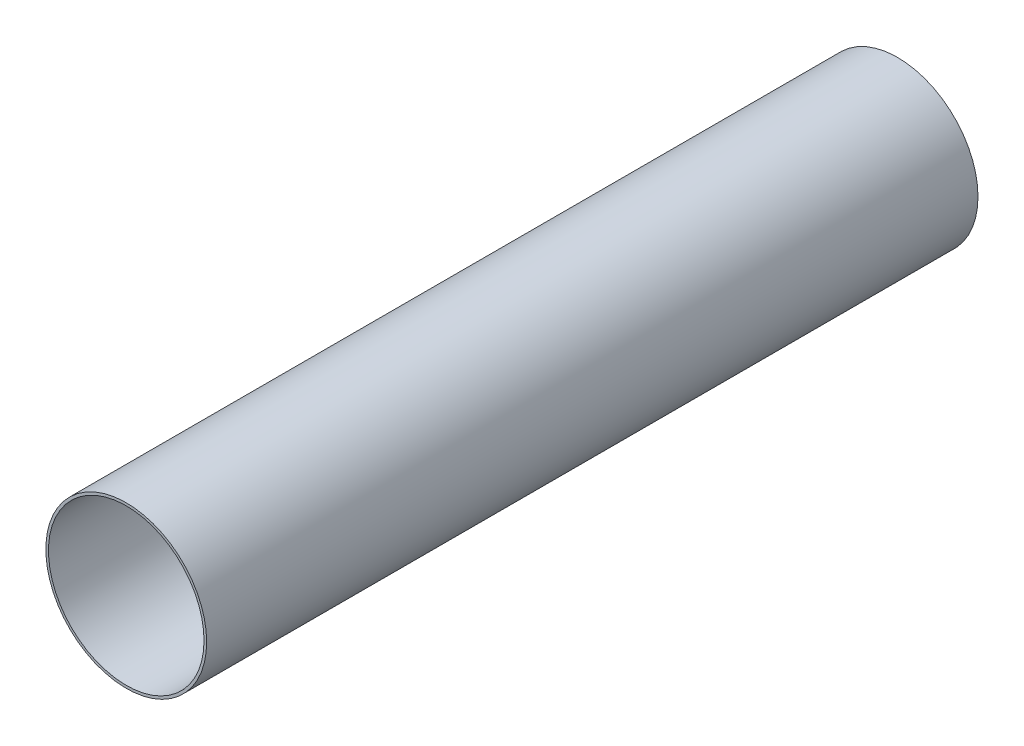
ISO-10303-21;
HEADER;
FILE_DESCRIPTION(('STEP AP214'),'2;1');
FILE_NAME('part.step','',(''),(''),'','','');
FILE_SCHEMA(('AUTOMOTIVE_DESIGN { 1 0 10303 214 1 1 1 1 }'));
ENDSEC;
DATA;
#1=APPLICATION_CONTEXT('core data for automotive mechanical design processes');
#2=APPLICATION_PROTOCOL_DEFINITION('international standard','automotive_design',2000,#1);
#3=PRODUCT_CONTEXT('',#1,'mechanical');
#4=PRODUCT('Part','Part','',(#3));
#5=PRODUCT_RELATED_PRODUCT_CATEGORY('part','',(#4));
#6=PRODUCT_DEFINITION_FORMATION('','',#4);
#7=PRODUCT_DEFINITION_CONTEXT('part definition',#1,'design');
#8=PRODUCT_DEFINITION('design','',#6,#7);
#9=PRODUCT_DEFINITION_SHAPE('','',#8);
#10=(LENGTH_UNIT() NAMED_UNIT(*) SI_UNIT(.MILLI.,.METRE.));
#11=(NAMED_UNIT(*) PLANE_ANGLE_UNIT() SI_UNIT($,.RADIAN.));
#12=(NAMED_UNIT(*) SI_UNIT($,.STERADIAN.) SOLID_ANGLE_UNIT());
#13=UNCERTAINTY_MEASURE_WITH_UNIT(LENGTH_MEASURE(1.E-05),#10,'distance_accuracy_value','');
#14=(GEOMETRIC_REPRESENTATION_CONTEXT(3) GLOBAL_UNCERTAINTY_ASSIGNED_CONTEXT((#13)) GLOBAL_UNIT_ASSIGNED_CONTEXT((#10,
#11,#12)) REPRESENTATION_CONTEXT('',''));
#15=CARTESIAN_POINT('',(0.,0.,0.));
#16=DIRECTION('',(0.,0.,1.));
#17=DIRECTION('',(1.,0.,0.));
#18=AXIS2_PLACEMENT_3D('',#15,#16,#17);
#19=CARTESIAN_POINT('',(0.,0.,295.));
#20=DIRECTION('',(0.,0.,1.));
#21=DIRECTION('',(1.,0.,0.));
#22=AXIS2_PLACEMENT_3D('',#19,#20,#21);
#23=PLANE('',#22);
#24=CARTESIAN_POINT('',(0.,0.,295.));
#25=DIRECTION('',(0.,0.,1.));
#26=DIRECTION('',(1.,0.,0.));
#27=AXIS2_PLACEMENT_3D('',#24,#25,#26);
#28=CIRCLE('',#27,61.5);
#29=CARTESIAN_POINT('',(61.5,0.,295.));
#30=VERTEX_POINT('',#29);
#31=EDGE_CURVE('E10',#30,#30,#28,.T.);
#32=ORIENTED_EDGE('',*,*,#31,.T.);
#33=EDGE_LOOP('',(#32));
#34=FACE_BOUND('',#33,.T.);
#35=CARTESIAN_POINT('',(0.,0.,295.));
#36=DIRECTION('',(0.,0.,1.));
#37=DIRECTION('',(1.,0.,0.));
#38=AXIS2_PLACEMENT_3D('',#35,#36,#37);
#39=CIRCLE('',#38,59.5);
#40=CARTESIAN_POINT('',(59.5,0.,295.));
#41=VERTEX_POINT('',#40);
#42=EDGE_CURVE('E54',#41,#41,#39,.T.);
#43=ORIENTED_EDGE('',*,*,#42,.F.);
#44=EDGE_LOOP('',(#43));
#45=FACE_BOUND('',#44,.T.);
#46=ADVANCED_FACE('F43',(#34,#45),#23,.T.);
#47=CARTESIAN_POINT('',(0.,0.,-295.));
#48=DIRECTION('',(0.,0.,1.));
#49=DIRECTION('',(1.,0.,0.));
#50=AXIS2_PLACEMENT_3D('',#47,#48,#49);
#51=PLANE('',#50);
#52=CARTESIAN_POINT('',(0.,0.,-295.));
#53=DIRECTION('',(0.,0.,1.));
#54=DIRECTION('',(1.,0.,0.));
#55=AXIS2_PLACEMENT_3D('',#52,#53,#54);
#56=CIRCLE('',#55,61.5);
#57=CARTESIAN_POINT('',(61.5,0.,-295.));
#58=VERTEX_POINT('',#57);
#59=EDGE_CURVE('E47',#58,#58,#56,.T.);
#60=ORIENTED_EDGE('',*,*,#59,.F.);
#61=EDGE_LOOP('',(#60));
#62=FACE_BOUND('',#61,.T.);
#63=CARTESIAN_POINT('',(0.,0.,-295.));
#64=DIRECTION('',(0.,0.,1.));
#65=DIRECTION('',(1.,0.,0.));
#66=AXIS2_PLACEMENT_3D('',#63,#64,#65);
#67=CIRCLE('',#66,59.5);
#68=CARTESIAN_POINT('',(59.5,0.,-295.));
#69=VERTEX_POINT('',#68);
#70=EDGE_CURVE('E56',#69,#69,#67,.T.);
#71=ORIENTED_EDGE('',*,*,#70,.T.);
#72=EDGE_LOOP('',(#71));
#73=FACE_BOUND('',#72,.T.);
#74=ADVANCED_FACE('F66',(#62,#73),#51,.F.);
#75=CARTESIAN_POINT('',(0.,0.,295.));
#76=DIRECTION('',(0.,0.,-1.));
#77=DIRECTION('',(-1.,0.,0.));
#78=AXIS2_PLACEMENT_3D('',#75,#76,#77);
#79=CYLINDRICAL_SURFACE('',#78,61.5);
#80=ORIENTED_EDGE('',*,*,#31,.F.);
#81=EDGE_LOOP('',(#80));
#82=FACE_BOUND('',#81,.T.);
#83=ORIENTED_EDGE('',*,*,#59,.T.);
#84=EDGE_LOOP('',(#83));
#85=FACE_BOUND('',#84,.T.);
#86=ADVANCED_FACE('F45',(#82,#85),#79,.T.);
#87=CARTESIAN_POINT('',(0.,0.,295.));
#88=DIRECTION('',(0.,0.,-1.));
#89=DIRECTION('',(-1.,0.,0.));
#90=AXIS2_PLACEMENT_3D('',#87,#88,#89);
#91=CYLINDRICAL_SURFACE('',#90,59.5);
#92=ORIENTED_EDGE('',*,*,#42,.T.);
#93=EDGE_LOOP('',(#92));
#94=FACE_BOUND('',#93,.T.);
#95=ORIENTED_EDGE('',*,*,#70,.F.);
#96=EDGE_LOOP('',(#95));
#97=FACE_BOUND('',#96,.T.);
#98=ADVANCED_FACE('F62',(#94,#97),#91,.F.);
#99=CLOSED_SHELL('',(#46,#74,#86,#98));
#100=MANIFOLD_SOLID_BREP('B2',#99);
#101=ADVANCED_BREP_SHAPE_REPRESENTATION('',(#18,#100),#14);
#102=SHAPE_DEFINITION_REPRESENTATION(#9,#101);
ENDSEC;
END-ISO-10303-21;
